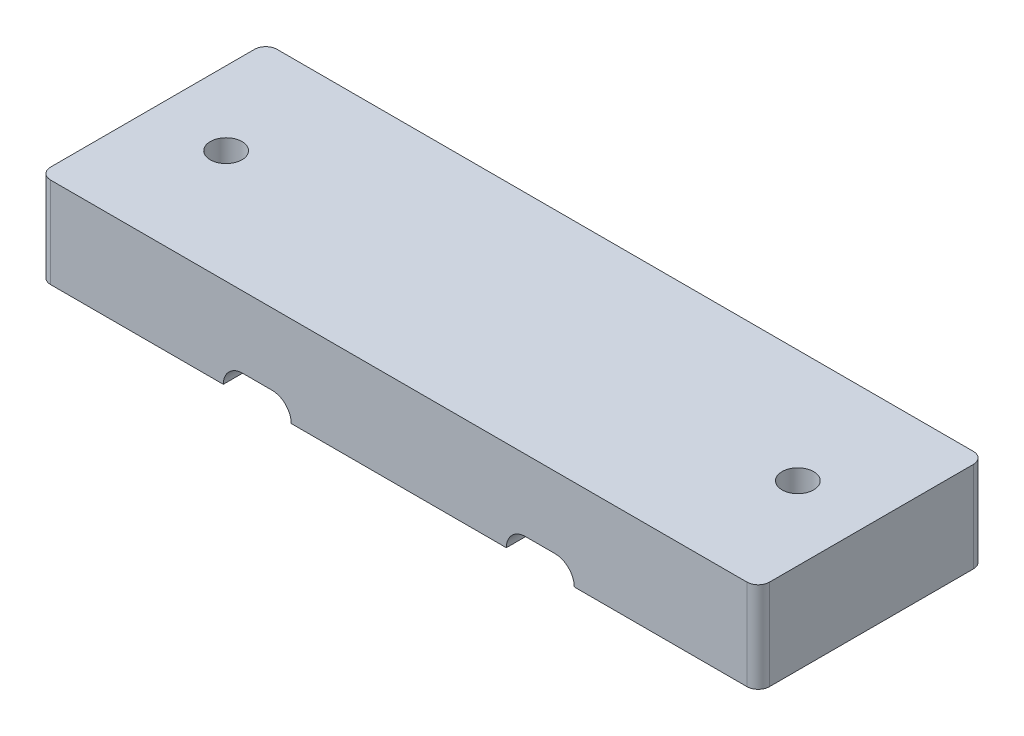
ISO-10303-21;
HEADER;
FILE_DESCRIPTION(('STEP AP214'),'2;1');
FILE_NAME('part.step','',(''),(''),'','','');
FILE_SCHEMA(('AUTOMOTIVE_DESIGN { 1 0 10303 214 1 1 1 1 }'));
ENDSEC;
DATA;
#1=APPLICATION_CONTEXT('core data for automotive mechanical design processes');
#2=APPLICATION_PROTOCOL_DEFINITION('international standard','automotive_design',2000,#1);
#3=PRODUCT_CONTEXT('',#1,'mechanical');
#4=PRODUCT('Part','Part','',(#3));
#5=PRODUCT_RELATED_PRODUCT_CATEGORY('part','',(#4));
#6=PRODUCT_DEFINITION_FORMATION('','',#4);
#7=PRODUCT_DEFINITION_CONTEXT('part definition',#1,'design');
#8=PRODUCT_DEFINITION('design','',#6,#7);
#9=PRODUCT_DEFINITION_SHAPE('','',#8);
#10=(LENGTH_UNIT() NAMED_UNIT(*) SI_UNIT(.MILLI.,.METRE.));
#11=(NAMED_UNIT(*) PLANE_ANGLE_UNIT() SI_UNIT($,.RADIAN.));
#12=(NAMED_UNIT(*) SI_UNIT($,.STERADIAN.) SOLID_ANGLE_UNIT());
#13=UNCERTAINTY_MEASURE_WITH_UNIT(LENGTH_MEASURE(1.E-05),#10,'distance_accuracy_value','');
#14=(GEOMETRIC_REPRESENTATION_CONTEXT(3) GLOBAL_UNCERTAINTY_ASSIGNED_CONTEXT((#13)) GLOBAL_UNIT_ASSIGNED_CONTEXT((#10,
#11,#12)) REPRESENTATION_CONTEXT('',''));
#15=CARTESIAN_POINT('',(0.,0.,0.));
#16=DIRECTION('',(0.,0.,1.));
#17=DIRECTION('',(1.,0.,0.));
#18=AXIS2_PLACEMENT_3D('',#15,#16,#17);
#19=CARTESIAN_POINT('',(0.,0.,0.));
#20=DIRECTION('',(0.,1.,0.));
#21=DIRECTION('',(0.,0.,1.));
#22=AXIS2_PLACEMENT_3D('',#19,#20,#21);
#23=PLANE('',#22);
#24=CARTESIAN_POINT('',(-25.25,0.,0.));
#25=DIRECTION('',(0.,1.,0.));
#26=DIRECTION('',(0.,0.,1.));
#27=AXIS2_PLACEMENT_3D('',#24,#25,#26);
#28=CIRCLE('',#27,1.4);
#29=CARTESIAN_POINT('',(-25.25,0.,1.4));
#30=VERTEX_POINT('',#29);
#31=EDGE_CURVE('E221',#30,#30,#28,.T.);
#32=ORIENTED_EDGE('',*,*,#31,.T.);
#33=EDGE_LOOP('',(#32));
#34=FACE_BOUND('',#33,.T.);
#35=DIRECTION('',(0.,0.,1.));
#36=VECTOR('',#35,1.);
#37=CARTESIAN_POINT('',(-31.75,0.,-10.));
#38=LINE('',#37,#36);
#39=CARTESIAN_POINT('',(-31.75,0.,-9.));
#40=VERTEX_POINT('',#39);
#41=CARTESIAN_POINT('',(-31.75,0.,9.));
#42=VERTEX_POINT('',#41);
#43=EDGE_CURVE('E227',#40,#42,#38,.T.);
#44=ORIENTED_EDGE('',*,*,#43,.F.);
#45=CARTESIAN_POINT('',(-30.75,0.,-9.));
#46=DIRECTION('',(0.,1.,0.));
#47=DIRECTION('',(0.,0.,1.));
#48=AXIS2_PLACEMENT_3D('',#45,#46,#47);
#49=CIRCLE('',#48,1.);
#50=CARTESIAN_POINT('',(-30.75,0.,-10.));
#51=VERTEX_POINT('',#50);
#52=EDGE_CURVE('E281',#40,#51,#49,.F.);
#53=ORIENTED_EDGE('',*,*,#52,.T.);
#54=DIRECTION('',(-1.,0.,0.));
#55=VECTOR('',#54,1.);
#56=CARTESIAN_POINT('',(-31.75,0.,-10.));
#57=LINE('',#56,#55);
#58=CARTESIAN_POINT('',(-15.5,0.,-10.));
#59=VERTEX_POINT('',#58);
#60=EDGE_CURVE('E251',#59,#51,#57,.T.);
#61=ORIENTED_EDGE('',*,*,#60,.F.);
#62=DIRECTION('',(0.,0.,-1.));
#63=VECTOR('',#62,1.);
#64=CARTESIAN_POINT('',(-15.5,0.,10.));
#65=LINE('',#64,#63);
#66=CARTESIAN_POINT('',(-15.5,0.,10.));
#67=VERTEX_POINT('',#66);
#68=EDGE_CURVE('E185',#67,#59,#65,.T.);
#69=ORIENTED_EDGE('',*,*,#68,.F.);
#70=DIRECTION('',(1.,0.,0.));
#71=VECTOR('',#70,1.);
#72=CARTESIAN_POINT('',(-31.75,0.,10.));
#73=LINE('',#72,#71);
#74=CARTESIAN_POINT('',(-30.75,0.,10.));
#75=VERTEX_POINT('',#74);
#76=EDGE_CURVE('E175',#75,#67,#73,.T.);
#77=ORIENTED_EDGE('',*,*,#76,.F.);
#78=CARTESIAN_POINT('',(-30.75,0.,9.));
#79=DIRECTION('',(0.,1.,0.));
#80=DIRECTION('',(0.,0.,1.));
#81=AXIS2_PLACEMENT_3D('',#78,#79,#80);
#82=CIRCLE('',#81,1.);
#83=EDGE_CURVE('E54',#75,#42,#82,.F.);
#84=ORIENTED_EDGE('',*,*,#83,.T.);
#85=EDGE_LOOP('',(#44,#53,#61,#69,#77,#84));
#86=FACE_BOUND('',#85,.T.);
#87=ADVANCED_FACE('F39',(#34,#86),#23,.F.);
#88=CARTESIAN_POINT('',(-9.5,0.,10.));
#89=VERTEX_POINT('',#88);
#90=CARTESIAN_POINT('',(9.5,0.,10.));
#91=VERTEX_POINT('',#90);
#92=EDGE_CURVE('E248',#89,#91,#73,.T.);
#93=ORIENTED_EDGE('',*,*,#92,.F.);
#94=DIRECTION('',(0.,0.,-1.));
#95=VECTOR('',#94,1.);
#96=CARTESIAN_POINT('',(-9.5,0.,10.));
#97=LINE('',#96,#95);
#98=CARTESIAN_POINT('',(-9.5,0.,-10.));
#99=VERTEX_POINT('',#98);
#100=EDGE_CURVE('E188',#89,#99,#97,.T.);
#101=ORIENTED_EDGE('',*,*,#100,.T.);
#102=CARTESIAN_POINT('',(9.5,0.,-10.));
#103=VERTEX_POINT('',#102);
#104=EDGE_CURVE('E253',#103,#99,#57,.T.);
#105=ORIENTED_EDGE('',*,*,#104,.F.);
#106=DIRECTION('',(0.,0.,-1.));
#107=VECTOR('',#106,1.);
#108=CARTESIAN_POINT('',(9.5,0.,10.));
#109=LINE('',#108,#107);
#110=EDGE_CURVE('E201',#91,#103,#109,.T.);
#111=ORIENTED_EDGE('',*,*,#110,.F.);
#112=EDGE_LOOP('',(#93,#101,#105,#111));
#113=FACE_BOUND('',#112,.T.);
#114=ADVANCED_FACE('F298',(#113),#23,.F.);
#115=CARTESIAN_POINT('',(0.,8.,0.));
#116=DIRECTION('',(0.,1.,0.));
#117=DIRECTION('',(0.,0.,1.));
#118=AXIS2_PLACEMENT_3D('',#115,#116,#117);
#119=PLANE('',#118);
#120=CARTESIAN_POINT('',(-25.25,8.,0.));
#121=DIRECTION('',(0.,1.,0.));
#122=DIRECTION('',(0.,0.,1.));
#123=AXIS2_PLACEMENT_3D('',#120,#121,#122);
#124=CIRCLE('',#123,1.4);
#125=CARTESIAN_POINT('',(-25.25,8.,1.4));
#126=VERTEX_POINT('',#125);
#127=EDGE_CURVE('E224',#126,#126,#124,.T.);
#128=ORIENTED_EDGE('',*,*,#127,.F.);
#129=EDGE_LOOP('',(#128));
#130=FACE_BOUND('',#129,.T.);
#131=DIRECTION('',(0.,0.,-1.));
#132=VECTOR('',#131,1.);
#133=CARTESIAN_POINT('',(31.75,8.,-10.));
#134=LINE('',#133,#132);
#135=CARTESIAN_POINT('',(31.75,8.,9.));
#136=VERTEX_POINT('',#135);
#137=CARTESIAN_POINT('',(31.75,8.,-9.));
#138=VERTEX_POINT('',#137);
#139=EDGE_CURVE('E237',#136,#138,#134,.T.);
#140=ORIENTED_EDGE('',*,*,#139,.T.);
#141=CARTESIAN_POINT('',(30.75,8.,-9.));
#142=DIRECTION('',(0.,1.,0.));
#143=DIRECTION('',(0.,0.,1.));
#144=AXIS2_PLACEMENT_3D('',#141,#142,#143);
#145=CIRCLE('',#144,1.);
#146=CARTESIAN_POINT('',(30.75,8.,-10.));
#147=VERTEX_POINT('',#146);
#148=EDGE_CURVE('E273',#138,#147,#145,.T.);
#149=ORIENTED_EDGE('',*,*,#148,.T.);
#150=DIRECTION('',(-1.,0.,0.));
#151=VECTOR('',#150,1.);
#152=CARTESIAN_POINT('',(-31.75,8.,-10.));
#153=LINE('',#152,#151);
#154=CARTESIAN_POINT('',(-30.75,8.,-10.));
#155=VERTEX_POINT('',#154);
#156=EDGE_CURVE('E240',#147,#155,#153,.T.);
#157=ORIENTED_EDGE('',*,*,#156,.T.);
#158=CARTESIAN_POINT('',(-30.75,8.,-9.));
#159=DIRECTION('',(0.,1.,0.));
#160=DIRECTION('',(0.,0.,1.));
#161=AXIS2_PLACEMENT_3D('',#158,#159,#160);
#162=CIRCLE('',#161,1.);
#163=CARTESIAN_POINT('',(-31.75,8.,-9.));
#164=VERTEX_POINT('',#163);
#165=EDGE_CURVE('E271',#155,#164,#162,.T.);
#166=ORIENTED_EDGE('',*,*,#165,.T.);
#167=DIRECTION('',(0.,0.,1.));
#168=VECTOR('',#167,1.);
#169=CARTESIAN_POINT('',(-31.75,8.,-10.));
#170=LINE('',#169,#168);
#171=CARTESIAN_POINT('',(-31.75,8.,9.));
#172=VERTEX_POINT('',#171);
#173=EDGE_CURVE('E230',#164,#172,#170,.T.);
#174=ORIENTED_EDGE('',*,*,#173,.T.);
#175=CARTESIAN_POINT('',(-30.75,8.,9.));
#176=DIRECTION('',(0.,1.,0.));
#177=DIRECTION('',(0.,0.,1.));
#178=AXIS2_PLACEMENT_3D('',#175,#176,#177);
#179=CIRCLE('',#178,1.);
#180=CARTESIAN_POINT('',(-30.75,8.,10.));
#181=VERTEX_POINT('',#180);
#182=EDGE_CURVE('E267',#172,#181,#179,.T.);
#183=ORIENTED_EDGE('',*,*,#182,.T.);
#184=DIRECTION('',(1.,0.,0.));
#185=VECTOR('',#184,1.);
#186=CARTESIAN_POINT('',(-31.75,8.,10.));
#187=LINE('',#186,#185);
#188=CARTESIAN_POINT('',(30.75,8.,10.));
#189=VERTEX_POINT('',#188);
#190=EDGE_CURVE('E233',#181,#189,#187,.T.);
#191=ORIENTED_EDGE('',*,*,#190,.T.);
#192=CARTESIAN_POINT('',(30.75,8.,9.));
#193=DIRECTION('',(0.,1.,0.));
#194=DIRECTION('',(0.,0.,1.));
#195=AXIS2_PLACEMENT_3D('',#192,#193,#194);
#196=CIRCLE('',#195,1.);
#197=EDGE_CURVE('E269',#189,#136,#196,.T.);
#198=ORIENTED_EDGE('',*,*,#197,.T.);
#199=EDGE_LOOP('',(#140,#149,#157,#166,#174,#183,#191,#198));
#200=FACE_BOUND('',#199,.T.);
#201=CARTESIAN_POINT('',(25.25,8.,0.));
#202=DIRECTION('',(0.,1.,0.));
#203=DIRECTION('',(0.,0.,-1.));
#204=AXIS2_PLACEMENT_3D('',#201,#202,#203);
#205=CIRCLE('',#204,1.4);
#206=CARTESIAN_POINT('',(25.25,8.,-1.4));
#207=VERTEX_POINT('',#206);
#208=EDGE_CURVE('E218',#207,#207,#205,.T.);
#209=ORIENTED_EDGE('',*,*,#208,.F.);
#210=EDGE_LOOP('',(#209));
#211=FACE_BOUND('',#210,.T.);
#212=ADVANCED_FACE('F311',(#130,#200,#211),#119,.T.);
#213=CARTESIAN_POINT('',(30.75,0.,-10.));
#214=VERTEX_POINT('',#213);
#215=CARTESIAN_POINT('',(15.5,0.,-10.));
#216=VERTEX_POINT('',#215);
#217=EDGE_CURVE('E234',#214,#216,#57,.T.);
#218=ORIENTED_EDGE('',*,*,#217,.F.);
#219=CARTESIAN_POINT('',(30.75,0.,-9.));
#220=DIRECTION('',(0.,1.,0.));
#221=DIRECTION('',(0.,0.,1.));
#222=AXIS2_PLACEMENT_3D('',#219,#220,#221);
#223=CIRCLE('',#222,1.);
#224=CARTESIAN_POINT('',(31.75,0.,-9.));
#225=VERTEX_POINT('',#224);
#226=EDGE_CURVE('E260',#214,#225,#223,.F.);
#227=ORIENTED_EDGE('',*,*,#226,.T.);
#228=DIRECTION('',(0.,0.,-1.));
#229=VECTOR('',#228,1.);
#230=CARTESIAN_POINT('',(31.75,0.,-10.));
#231=LINE('',#230,#229);
#232=CARTESIAN_POINT('',(31.75,0.,9.));
#233=VERTEX_POINT('',#232);
#234=EDGE_CURVE('E247',#233,#225,#231,.T.);
#235=ORIENTED_EDGE('',*,*,#234,.F.);
#236=CARTESIAN_POINT('',(30.75,0.,9.));
#237=DIRECTION('',(0.,1.,0.));
#238=DIRECTION('',(0.,0.,1.));
#239=AXIS2_PLACEMENT_3D('',#236,#237,#238);
#240=CIRCLE('',#239,1.);
#241=CARTESIAN_POINT('',(30.75,0.,10.));
#242=VERTEX_POINT('',#241);
#243=EDGE_CURVE('E258',#233,#242,#240,.F.);
#244=ORIENTED_EDGE('',*,*,#243,.T.);
#245=CARTESIAN_POINT('',(15.5,0.,10.));
#246=VERTEX_POINT('',#245);
#247=EDGE_CURVE('E245',#246,#242,#73,.T.);
#248=ORIENTED_EDGE('',*,*,#247,.F.);
#249=DIRECTION('',(0.,0.,-1.));
#250=VECTOR('',#249,1.);
#251=CARTESIAN_POINT('',(15.5,0.,10.));
#252=LINE('',#251,#250);
#253=EDGE_CURVE('E198',#246,#216,#252,.T.);
#254=ORIENTED_EDGE('',*,*,#253,.T.);
#255=EDGE_LOOP('',(#218,#227,#235,#244,#248,#254));
#256=FACE_BOUND('',#255,.T.);
#257=CARTESIAN_POINT('',(25.25,0.,0.));
#258=DIRECTION('',(0.,1.,0.));
#259=DIRECTION('',(0.,0.,-1.));
#260=AXIS2_PLACEMENT_3D('',#257,#258,#259);
#261=CIRCLE('',#260,1.4);
#262=CARTESIAN_POINT('',(25.25,0.,-1.4));
#263=VERTEX_POINT('',#262);
#264=EDGE_CURVE('E187',#263,#263,#261,.T.);
#265=ORIENTED_EDGE('',*,*,#264,.T.);
#266=EDGE_LOOP('',(#265));
#267=FACE_BOUND('',#266,.T.);
#268=ADVANCED_FACE('F336',(#256,#267),#23,.F.);
#269=CARTESIAN_POINT('',(-31.75,8.,-10.));
#270=DIRECTION('',(1.,0.,0.));
#271=DIRECTION('',(0.,0.,-1.));
#272=AXIS2_PLACEMENT_3D('',#269,#270,#271);
#273=PLANE('',#272);
#274=ORIENTED_EDGE('',*,*,#173,.F.);
#275=DIRECTION('',(0.,-1.,0.));
#276=VECTOR('',#275,1.);
#277=CARTESIAN_POINT('',(-31.75,8.,-9.));
#278=LINE('',#277,#276);
#279=EDGE_CURVE('E277',#164,#40,#278,.T.);
#280=ORIENTED_EDGE('',*,*,#279,.T.);
#281=ORIENTED_EDGE('',*,*,#43,.T.);
#282=DIRECTION('',(0.,-1.,0.));
#283=VECTOR('',#282,1.);
#284=CARTESIAN_POINT('',(-31.75,8.,9.));
#285=LINE('',#284,#283);
#286=EDGE_CURVE('E275',#42,#172,#285,.F.);
#287=ORIENTED_EDGE('',*,*,#286,.T.);
#288=EDGE_LOOP('',(#274,#280,#281,#287));
#289=FACE_BOUND('',#288,.T.);
#290=ADVANCED_FACE('F328',(#289),#273,.F.);
#291=CARTESIAN_POINT('',(-31.75,8.,10.));
#292=DIRECTION('',(0.,0.,-1.));
#293=DIRECTION('',(-1.,0.,0.));
#294=AXIS2_PLACEMENT_3D('',#291,#292,#293);
#295=PLANE('',#294);
#296=ORIENTED_EDGE('',*,*,#247,.T.);
#297=DIRECTION('',(0.,-1.,0.));
#298=VECTOR('',#297,1.);
#299=CARTESIAN_POINT('',(30.75,8.,10.));
#300=LINE('',#299,#298);
#301=EDGE_CURVE('E11',#242,#189,#300,.F.);
#302=ORIENTED_EDGE('',*,*,#301,.T.);
#303=ORIENTED_EDGE('',*,*,#190,.F.);
#304=DIRECTION('',(0.,-1.,0.));
#305=VECTOR('',#304,1.);
#306=CARTESIAN_POINT('',(-30.75,8.,10.));
#307=LINE('',#306,#305);
#308=EDGE_CURVE('E47',#181,#75,#307,.T.);
#309=ORIENTED_EDGE('',*,*,#308,.T.);
#310=ORIENTED_EDGE('',*,*,#76,.T.);
#311=CARTESIAN_POINT('',(-13.8,0.,10.));
#312=DIRECTION('',(0.,0.,-1.));
#313=DIRECTION('',(1.,0.,0.));
#314=AXIS2_PLACEMENT_3D('',#311,#312,#313);
#315=CIRCLE('',#314,1.7);
#316=CARTESIAN_POINT('',(-13.8,1.7,10.));
#317=VERTEX_POINT('',#316);
#318=EDGE_CURVE('E156',#67,#317,#315,.T.);
#319=ORIENTED_EDGE('',*,*,#318,.T.);
#320=DIRECTION('',(1.,0.,0.));
#321=VECTOR('',#320,1.);
#322=CARTESIAN_POINT('',(-13.8,1.7,10.));
#323=LINE('',#322,#321);
#324=CARTESIAN_POINT('',(-11.2,1.7,10.));
#325=VERTEX_POINT('',#324);
#326=EDGE_CURVE('E167',#317,#325,#323,.T.);
#327=ORIENTED_EDGE('',*,*,#326,.T.);
#328=CARTESIAN_POINT('',(-11.2,0.,10.));
#329=DIRECTION('',(0.,0.,-1.));
#330=DIRECTION('',(-1.,0.,0.));
#331=AXIS2_PLACEMENT_3D('',#328,#329,#330);
#332=CIRCLE('',#331,1.7);
#333=EDGE_CURVE('E164',#325,#89,#332,.T.);
#334=ORIENTED_EDGE('',*,*,#333,.T.);
#335=ORIENTED_EDGE('',*,*,#92,.T.);
#336=CARTESIAN_POINT('',(11.2,0.,10.));
#337=DIRECTION('',(0.,0.,-1.));
#338=DIRECTION('',(1.,0.,0.));
#339=AXIS2_PLACEMENT_3D('',#336,#337,#338);
#340=CIRCLE('',#339,1.7);
#341=CARTESIAN_POINT('',(11.2,1.7,10.));
#342=VERTEX_POINT('',#341);
#343=EDGE_CURVE('E207',#91,#342,#340,.T.);
#344=ORIENTED_EDGE('',*,*,#343,.T.);
#345=DIRECTION('',(1.,0.,0.));
#346=VECTOR('',#345,1.);
#347=CARTESIAN_POINT('',(11.2,1.7,10.));
#348=LINE('',#347,#346);
#349=CARTESIAN_POINT('',(13.8,1.7,10.));
#350=VERTEX_POINT('',#349);
#351=EDGE_CURVE('E213',#342,#350,#348,.T.);
#352=ORIENTED_EDGE('',*,*,#351,.T.);
#353=CARTESIAN_POINT('',(13.8,0.,10.));
#354=DIRECTION('',(0.,0.,-1.));
#355=DIRECTION('',(-1.,0.,0.));
#356=AXIS2_PLACEMENT_3D('',#353,#354,#355);
#357=CIRCLE('',#356,1.7);
#358=EDGE_CURVE('E195',#350,#246,#357,.T.);
#359=ORIENTED_EDGE('',*,*,#358,.T.);
#360=EDGE_LOOP('',(#296,#302,#303,#309,#310,#319,#327,#334,#335,#344,#352,#359));
#361=FACE_BOUND('',#360,.T.);
#362=ADVANCED_FACE('F174',(#361),#295,.F.);
#363=CARTESIAN_POINT('',(31.75,8.,-10.));
#364=DIRECTION('',(-1.,0.,0.));
#365=DIRECTION('',(0.,0.,1.));
#366=AXIS2_PLACEMENT_3D('',#363,#364,#365);
#367=PLANE('',#366);
#368=ORIENTED_EDGE('',*,*,#234,.T.);
#369=DIRECTION('',(0.,-1.,0.));
#370=VECTOR('',#369,1.);
#371=CARTESIAN_POINT('',(31.75,8.,-9.));
#372=LINE('',#371,#370);
#373=EDGE_CURVE('E265',#225,#138,#372,.F.);
#374=ORIENTED_EDGE('',*,*,#373,.T.);
#375=ORIENTED_EDGE('',*,*,#139,.F.);
#376=DIRECTION('',(0.,-1.,0.));
#377=VECTOR('',#376,1.);
#378=CARTESIAN_POINT('',(31.75,8.,9.));
#379=LINE('',#378,#377);
#380=EDGE_CURVE('E262',#136,#233,#379,.T.);
#381=ORIENTED_EDGE('',*,*,#380,.T.);
#382=EDGE_LOOP('',(#368,#374,#375,#381));
#383=FACE_BOUND('',#382,.T.);
#384=ADVANCED_FACE('F315',(#383),#367,.F.);
#385=CARTESIAN_POINT('',(-31.75,8.,-10.));
#386=DIRECTION('',(0.,0.,1.));
#387=DIRECTION('',(1.,0.,0.));
#388=AXIS2_PLACEMENT_3D('',#385,#386,#387);
#389=PLANE('',#388);
#390=ORIENTED_EDGE('',*,*,#156,.F.);
#391=DIRECTION('',(0.,-1.,0.));
#392=VECTOR('',#391,1.);
#393=CARTESIAN_POINT('',(30.75,8.,-10.));
#394=LINE('',#393,#392);
#395=EDGE_CURVE('E255',#147,#214,#394,.T.);
#396=ORIENTED_EDGE('',*,*,#395,.T.);
#397=ORIENTED_EDGE('',*,*,#217,.T.);
#398=CARTESIAN_POINT('',(13.8,0.,-10.));
#399=DIRECTION('',(0.,0.,-1.));
#400=DIRECTION('',(-1.,0.,0.));
#401=AXIS2_PLACEMENT_3D('',#398,#399,#400);
#402=CIRCLE('',#401,1.7);
#403=CARTESIAN_POINT('',(13.8,1.7,-10.));
#404=VERTEX_POINT('',#403);
#405=EDGE_CURVE('E203',#404,#216,#402,.T.);
#406=ORIENTED_EDGE('',*,*,#405,.F.);
#407=DIRECTION('',(1.,0.,0.));
#408=VECTOR('',#407,1.);
#409=CARTESIAN_POINT('',(11.2,1.7,-10.));
#410=LINE('',#409,#408);
#411=CARTESIAN_POINT('',(11.2,1.7,-10.));
#412=VERTEX_POINT('',#411);
#413=EDGE_CURVE('E206',#412,#404,#410,.T.);
#414=ORIENTED_EDGE('',*,*,#413,.F.);
#415=CARTESIAN_POINT('',(11.2,0.,-10.));
#416=DIRECTION('',(0.,0.,-1.));
#417=DIRECTION('',(1.,0.,0.));
#418=AXIS2_PLACEMENT_3D('',#415,#416,#417);
#419=CIRCLE('',#418,1.7);
#420=EDGE_CURVE('E183',#103,#412,#419,.T.);
#421=ORIENTED_EDGE('',*,*,#420,.F.);
#422=ORIENTED_EDGE('',*,*,#104,.T.);
#423=CARTESIAN_POINT('',(-11.2,0.,-10.));
#424=DIRECTION('',(0.,0.,-1.));
#425=DIRECTION('',(-1.,0.,0.));
#426=AXIS2_PLACEMENT_3D('',#423,#424,#425);
#427=CIRCLE('',#426,1.7);
#428=CARTESIAN_POINT('',(-11.2,1.7,-10.));
#429=VERTEX_POINT('',#428);
#430=EDGE_CURVE('E176',#429,#99,#427,.T.);
#431=ORIENTED_EDGE('',*,*,#430,.F.);
#432=DIRECTION('',(1.,0.,0.));
#433=VECTOR('',#432,1.);
#434=CARTESIAN_POINT('',(-13.8,1.7,-10.));
#435=LINE('',#434,#433);
#436=CARTESIAN_POINT('',(-13.8,1.7,-10.));
#437=VERTEX_POINT('',#436);
#438=EDGE_CURVE('E178',#437,#429,#435,.T.);
#439=ORIENTED_EDGE('',*,*,#438,.F.);
#440=CARTESIAN_POINT('',(-13.8,0.,-10.));
#441=DIRECTION('',(0.,0.,-1.));
#442=DIRECTION('',(1.,0.,0.));
#443=AXIS2_PLACEMENT_3D('',#440,#441,#442);
#444=CIRCLE('',#443,1.7);
#445=EDGE_CURVE('E159',#59,#437,#444,.T.);
#446=ORIENTED_EDGE('',*,*,#445,.F.);
#447=ORIENTED_EDGE('',*,*,#60,.T.);
#448=DIRECTION('',(0.,-1.,0.));
#449=VECTOR('',#448,1.);
#450=CARTESIAN_POINT('',(-30.75,8.,-10.));
#451=LINE('',#450,#449);
#452=EDGE_CURVE('E243',#51,#155,#451,.F.);
#453=ORIENTED_EDGE('',*,*,#452,.T.);
#454=EDGE_LOOP('',(#390,#396,#397,#406,#414,#421,#422,#431,#439,#446,#447,#453));
#455=FACE_BOUND('',#454,.T.);
#456=ADVANCED_FACE('F288',(#455),#389,.F.);
#457=CARTESIAN_POINT('',(-25.25,8.,0.));
#458=DIRECTION('',(0.,-1.,0.));
#459=DIRECTION('',(0.,0.,-1.));
#460=AXIS2_PLACEMENT_3D('',#457,#458,#459);
#461=CYLINDRICAL_SURFACE('',#460,1.4);
#462=ORIENTED_EDGE('',*,*,#127,.T.);
#463=EDGE_LOOP('',(#462));
#464=FACE_BOUND('',#463,.T.);
#465=ORIENTED_EDGE('',*,*,#31,.F.);
#466=EDGE_LOOP('',(#465));
#467=FACE_BOUND('',#466,.T.);
#468=ADVANCED_FACE('F355',(#464,#467),#461,.F.);
#469=CARTESIAN_POINT('',(25.25,8.,0.));
#470=DIRECTION('',(0.,-1.,0.));
#471=DIRECTION('',(0.,0.,-1.));
#472=AXIS2_PLACEMENT_3D('',#469,#470,#471);
#473=CYLINDRICAL_SURFACE('',#472,1.4);
#474=ORIENTED_EDGE('',*,*,#208,.T.);
#475=EDGE_LOOP('',(#474));
#476=FACE_BOUND('',#475,.T.);
#477=ORIENTED_EDGE('',*,*,#264,.F.);
#478=EDGE_LOOP('',(#477));
#479=FACE_BOUND('',#478,.T.);
#480=ADVANCED_FACE('F352',(#476,#479),#473,.F.);
#481=CARTESIAN_POINT('',(11.2,0.,10.));
#482=DIRECTION('',(0.,0.,-1.));
#483=DIRECTION('',(-1.,0.,0.));
#484=AXIS2_PLACEMENT_3D('',#481,#482,#483);
#485=CYLINDRICAL_SURFACE('',#484,1.7);
#486=ORIENTED_EDGE('',*,*,#420,.T.);
#487=DIRECTION('',(0.,0.,-1.));
#488=VECTOR('',#487,1.);
#489=CARTESIAN_POINT('',(11.2,1.7,10.));
#490=LINE('',#489,#488);
#491=EDGE_CURVE('E192',#342,#412,#490,.T.);
#492=ORIENTED_EDGE('',*,*,#491,.F.);
#493=ORIENTED_EDGE('',*,*,#343,.F.);
#494=ORIENTED_EDGE('',*,*,#110,.T.);
#495=EDGE_LOOP('',(#486,#492,#493,#494));
#496=FACE_BOUND('',#495,.T.);
#497=ADVANCED_FACE('F354',(#496),#485,.F.);
#498=CARTESIAN_POINT('',(13.8,0.,10.));
#499=DIRECTION('',(0.,0.,-1.));
#500=DIRECTION('',(-1.,0.,0.));
#501=AXIS2_PLACEMENT_3D('',#498,#499,#500);
#502=CYLINDRICAL_SURFACE('',#501,1.7);
#503=ORIENTED_EDGE('',*,*,#405,.T.);
#504=ORIENTED_EDGE('',*,*,#253,.F.);
#505=ORIENTED_EDGE('',*,*,#358,.F.);
#506=DIRECTION('',(0.,0.,-1.));
#507=VECTOR('',#506,1.);
#508=CARTESIAN_POINT('',(13.8,1.7,10.));
#509=LINE('',#508,#507);
#510=EDGE_CURVE('E196',#350,#404,#509,.T.);
#511=ORIENTED_EDGE('',*,*,#510,.T.);
#512=EDGE_LOOP('',(#503,#504,#505,#511));
#513=FACE_BOUND('',#512,.T.);
#514=ADVANCED_FACE('F362',(#513),#502,.F.);
#515=CARTESIAN_POINT('',(11.2,1.7,10.));
#516=DIRECTION('',(0.,1.,0.));
#517=DIRECTION('',(0.,0.,1.));
#518=AXIS2_PLACEMENT_3D('',#515,#516,#517);
#519=PLANE('',#518);
#520=ORIENTED_EDGE('',*,*,#413,.T.);
#521=ORIENTED_EDGE('',*,*,#510,.F.);
#522=ORIENTED_EDGE('',*,*,#351,.F.);
#523=ORIENTED_EDGE('',*,*,#491,.T.);
#524=EDGE_LOOP('',(#520,#521,#522,#523));
#525=FACE_BOUND('',#524,.T.);
#526=ADVANCED_FACE('F370',(#525),#519,.F.);
#527=CARTESIAN_POINT('',(-13.8,0.,10.));
#528=DIRECTION('',(0.,0.,-1.));
#529=DIRECTION('',(-1.,0.,0.));
#530=AXIS2_PLACEMENT_3D('',#527,#528,#529);
#531=CYLINDRICAL_SURFACE('',#530,1.7);
#532=ORIENTED_EDGE('',*,*,#445,.T.);
#533=DIRECTION('',(0.,0.,-1.));
#534=VECTOR('',#533,1.);
#535=CARTESIAN_POINT('',(-13.8,1.7,10.));
#536=LINE('',#535,#534);
#537=EDGE_CURVE('E152',#317,#437,#536,.T.);
#538=ORIENTED_EDGE('',*,*,#537,.F.);
#539=ORIENTED_EDGE('',*,*,#318,.F.);
#540=ORIENTED_EDGE('',*,*,#68,.T.);
#541=EDGE_LOOP('',(#532,#538,#539,#540));
#542=FACE_BOUND('',#541,.T.);
#543=ADVANCED_FACE('F154',(#542),#531,.F.);
#544=CARTESIAN_POINT('',(-11.2,0.,10.));
#545=DIRECTION('',(0.,0.,-1.));
#546=DIRECTION('',(-1.,0.,0.));
#547=AXIS2_PLACEMENT_3D('',#544,#545,#546);
#548=CYLINDRICAL_SURFACE('',#547,1.7);
#549=ORIENTED_EDGE('',*,*,#430,.T.);
#550=ORIENTED_EDGE('',*,*,#100,.F.);
#551=ORIENTED_EDGE('',*,*,#333,.F.);
#552=DIRECTION('',(0.,0.,-1.));
#553=VECTOR('',#552,1.);
#554=CARTESIAN_POINT('',(-11.2,1.7,10.));
#555=LINE('',#554,#553);
#556=EDGE_CURVE('E163',#325,#429,#555,.T.);
#557=ORIENTED_EDGE('',*,*,#556,.T.);
#558=EDGE_LOOP('',(#549,#550,#551,#557));
#559=FACE_BOUND('',#558,.T.);
#560=ADVANCED_FACE('F295',(#559),#548,.F.);
#561=CARTESIAN_POINT('',(-13.8,1.7,10.));
#562=DIRECTION('',(0.,1.,0.));
#563=DIRECTION('',(0.,0.,1.));
#564=AXIS2_PLACEMENT_3D('',#561,#562,#563);
#565=PLANE('',#564);
#566=ORIENTED_EDGE('',*,*,#438,.T.);
#567=ORIENTED_EDGE('',*,*,#556,.F.);
#568=ORIENTED_EDGE('',*,*,#326,.F.);
#569=ORIENTED_EDGE('',*,*,#537,.T.);
#570=EDGE_LOOP('',(#566,#567,#568,#569));
#571=FACE_BOUND('',#570,.T.);
#572=ADVANCED_FACE('F168',(#571),#565,.F.);
#573=CARTESIAN_POINT('',(30.75,8.,-9.));
#574=DIRECTION('',(0.,-1.,0.));
#575=DIRECTION('',(0.,0.,-1.));
#576=AXIS2_PLACEMENT_3D('',#573,#574,#575);
#577=CYLINDRICAL_SURFACE('',#576,1.);
#578=ORIENTED_EDGE('',*,*,#148,.F.);
#579=ORIENTED_EDGE('',*,*,#373,.F.);
#580=ORIENTED_EDGE('',*,*,#226,.F.);
#581=ORIENTED_EDGE('',*,*,#395,.F.);
#582=EDGE_LOOP('',(#578,#579,#580,#581));
#583=FACE_BOUND('',#582,.T.);
#584=ADVANCED_FACE('F319',(#583),#577,.T.);
#585=CARTESIAN_POINT('',(-30.75,8.,-9.));
#586=DIRECTION('',(0.,-1.,0.));
#587=DIRECTION('',(0.,0.,-1.));
#588=AXIS2_PLACEMENT_3D('',#585,#586,#587);
#589=CYLINDRICAL_SURFACE('',#588,1.);
#590=ORIENTED_EDGE('',*,*,#165,.F.);
#591=ORIENTED_EDGE('',*,*,#452,.F.);
#592=ORIENTED_EDGE('',*,*,#52,.F.);
#593=ORIENTED_EDGE('',*,*,#279,.F.);
#594=EDGE_LOOP('',(#590,#591,#592,#593));
#595=FACE_BOUND('',#594,.T.);
#596=ADVANCED_FACE('F324',(#595),#589,.T.);
#597=CARTESIAN_POINT('',(30.75,8.,9.));
#598=DIRECTION('',(0.,-1.,0.));
#599=DIRECTION('',(0.,0.,-1.));
#600=AXIS2_PLACEMENT_3D('',#597,#598,#599);
#601=CYLINDRICAL_SURFACE('',#600,1.);
#602=ORIENTED_EDGE('',*,*,#197,.F.);
#603=ORIENTED_EDGE('',*,*,#301,.F.);
#604=ORIENTED_EDGE('',*,*,#243,.F.);
#605=ORIENTED_EDGE('',*,*,#380,.F.);
#606=EDGE_LOOP('',(#602,#603,#604,#605));
#607=FACE_BOUND('',#606,.T.);
#608=ADVANCED_FACE('F307',(#607),#601,.T.);
#609=CARTESIAN_POINT('',(-30.75,8.,9.));
#610=DIRECTION('',(0.,-1.,0.));
#611=DIRECTION('',(0.,0.,-1.));
#612=AXIS2_PLACEMENT_3D('',#609,#610,#611);
#613=CYLINDRICAL_SURFACE('',#612,1.);
#614=ORIENTED_EDGE('',*,*,#182,.F.);
#615=ORIENTED_EDGE('',*,*,#286,.F.);
#616=ORIENTED_EDGE('',*,*,#83,.F.);
#617=ORIENTED_EDGE('',*,*,#308,.F.);
#618=EDGE_LOOP('',(#614,#615,#616,#617));
#619=FACE_BOUND('',#618,.T.);
#620=ADVANCED_FACE('F41',(#619),#613,.T.);
#621=CLOSED_SHELL('',(#87,#114,#212,#268,#290,#362,#384,#456,#468,#480,#497,#514,#526,#543,#560,
#572,#584,#596,#608,#620));
#622=MANIFOLD_SOLID_BREP('B2',#621);
#623=ADVANCED_BREP_SHAPE_REPRESENTATION('',(#18,#622),#14);
#624=SHAPE_DEFINITION_REPRESENTATION(#9,#623);
ENDSEC;
END-ISO-10303-21;
